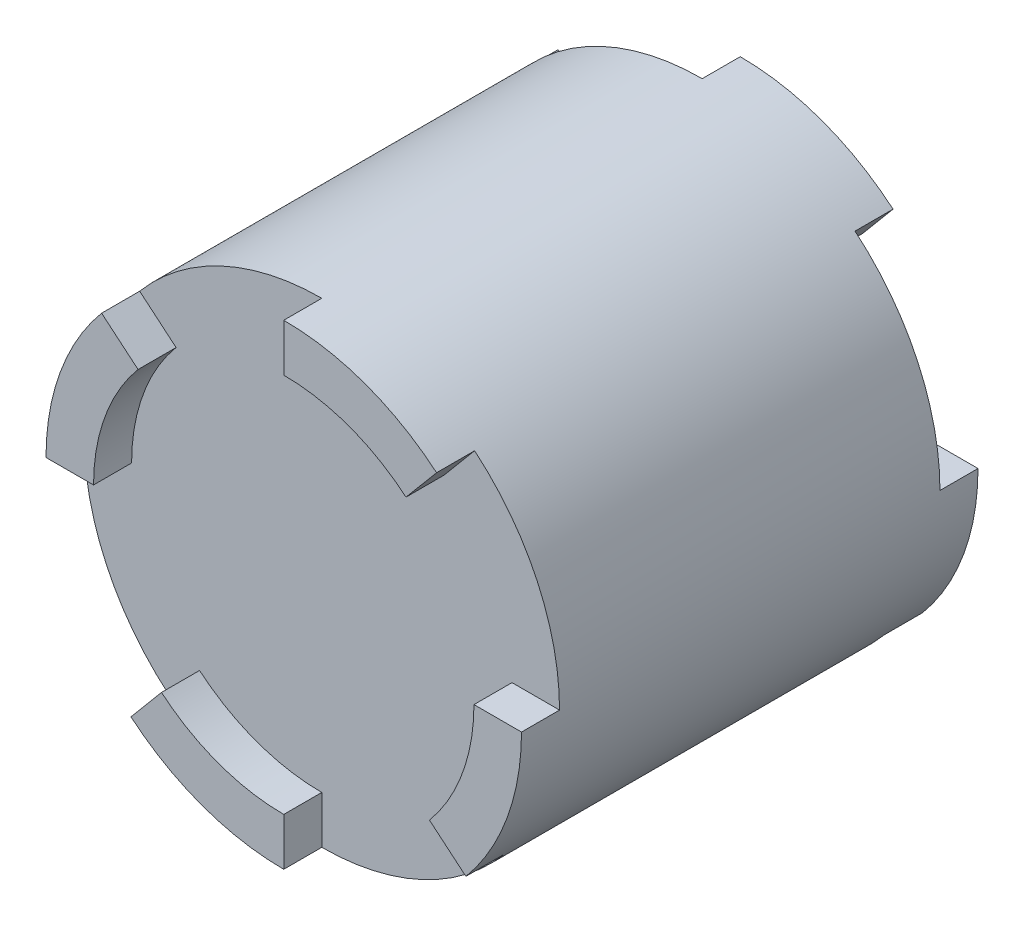
ISO-10303-21;
HEADER;
FILE_DESCRIPTION(('STEP AP214'),'2;1');
FILE_NAME('part.step','',(''),(''),'','','');
FILE_SCHEMA(('AUTOMOTIVE_DESIGN { 1 0 10303 214 1 1 1 1 }'));
ENDSEC;
DATA;
#1=APPLICATION_CONTEXT('core data for automotive mechanical design processes');
#2=APPLICATION_PROTOCOL_DEFINITION('international standard','automotive_design',2000,#1);
#3=PRODUCT_CONTEXT('',#1,'mechanical');
#4=PRODUCT('Part','Part','',(#3));
#5=PRODUCT_RELATED_PRODUCT_CATEGORY('part','',(#4));
#6=PRODUCT_DEFINITION_FORMATION('','',#4);
#7=PRODUCT_DEFINITION_CONTEXT('part definition',#1,'design');
#8=PRODUCT_DEFINITION('design','',#6,#7);
#9=PRODUCT_DEFINITION_SHAPE('','',#8);
#10=(LENGTH_UNIT() NAMED_UNIT(*) SI_UNIT(.MILLI.,.METRE.));
#11=(NAMED_UNIT(*) PLANE_ANGLE_UNIT() SI_UNIT($,.RADIAN.));
#12=(NAMED_UNIT(*) SI_UNIT($,.STERADIAN.) SOLID_ANGLE_UNIT());
#13=UNCERTAINTY_MEASURE_WITH_UNIT(LENGTH_MEASURE(1.E-05),#10,'distance_accuracy_value','');
#14=(GEOMETRIC_REPRESENTATION_CONTEXT(3) GLOBAL_UNCERTAINTY_ASSIGNED_CONTEXT((#13)) GLOBAL_UNIT_ASSIGNED_CONTEXT((#10,
#11,#12)) REPRESENTATION_CONTEXT('',''));
#15=CARTESIAN_POINT('',(0.,0.,0.));
#16=DIRECTION('',(0.,0.,1.));
#17=DIRECTION('',(1.,0.,0.));
#18=AXIS2_PLACEMENT_3D('',#15,#16,#17);
#19=CARTESIAN_POINT('',(0.,0.,20.));
#20=DIRECTION('',(0.,0.,1.));
#21=DIRECTION('',(1.,0.,0.));
#22=AXIS2_PLACEMENT_3D('',#19,#20,#21);
#23=PLANE('',#22);
#24=CARTESIAN_POINT('',(0.,0.,20.));
#25=DIRECTION('',(0.,0.,-1.));
#26=DIRECTION('',(1.,0.,0.));
#27=AXIS2_PLACEMENT_3D('',#24,#25,#26);
#28=CIRCLE('',#27,20.);
#29=CARTESIAN_POINT('',(0.,-20.,20.));
#30=VERTEX_POINT('',#29);
#31=CARTESIAN_POINT('',(-12.8557521937308,-15.3208888623795,20.));
#32=VERTEX_POINT('',#31);
#33=EDGE_CURVE('E391',#30,#32,#28,.T.);
#34=ORIENTED_EDGE('',*,*,#33,.F.);
#35=DIRECTION('',(0.,1.,0.));
#36=VECTOR('',#35,1.);
#37=CARTESIAN_POINT('',(0.,-20.,20.));
#38=LINE('',#37,#36);
#39=CARTESIAN_POINT('',(0.,-25.,20.));
#40=VERTEX_POINT('',#39);
#41=EDGE_CURVE('E377',#40,#30,#38,.T.);
#42=ORIENTED_EDGE('',*,*,#41,.F.);
#43=CARTESIAN_POINT('',(0.,0.,20.));
#44=DIRECTION('',(0.,0.,1.));
#45=DIRECTION('',(1.,0.,0.));
#46=AXIS2_PLACEMENT_3D('',#43,#44,#45);
#47=CIRCLE('',#46,25.);
#48=CARTESIAN_POINT('',(19.1511110779744,-16.0696902421635,20.));
#49=VERTEX_POINT('',#48);
#50=EDGE_CURVE('E49',#40,#49,#47,.T.);
#51=ORIENTED_EDGE('',*,*,#50,.T.);
#52=DIRECTION('',(0.766044443118977,-0.64278760968654,0.));
#53=VECTOR('',#52,1.);
#54=CARTESIAN_POINT('',(19.1511110779744,-16.0696902421635,20.));
#55=LINE('',#54,#53);
#56=CARTESIAN_POINT('',(15.3208888623795,-12.8557521937308,20.));
#57=VERTEX_POINT('',#56);
#58=EDGE_CURVE('E477',#57,#49,#55,.T.);
#59=ORIENTED_EDGE('',*,*,#58,.F.);
#60=CARTESIAN_POINT('',(0.,0.,20.));
#61=DIRECTION('',(0.,0.,-1.));
#62=DIRECTION('',(1.,0.,0.));
#63=AXIS2_PLACEMENT_3D('',#60,#61,#62);
#64=CIRCLE('',#63,20.);
#65=CARTESIAN_POINT('',(20.,0.,20.));
#66=VERTEX_POINT('',#65);
#67=EDGE_CURVE('E463',#66,#57,#64,.T.);
#68=ORIENTED_EDGE('',*,*,#67,.F.);
#69=DIRECTION('',(-1.,0.,0.));
#70=VECTOR('',#69,1.);
#71=CARTESIAN_POINT('',(25.,0.,20.));
#72=LINE('',#71,#70);
#73=CARTESIAN_POINT('',(25.,0.,20.));
#74=VERTEX_POINT('',#73);
#75=EDGE_CURVE('E468',#74,#66,#72,.T.);
#76=ORIENTED_EDGE('',*,*,#75,.F.);
#77=CARTESIAN_POINT('',(16.0696902421635,19.1511110779744,20.));
#78=VERTEX_POINT('',#77);
#79=EDGE_CURVE('E11',#74,#78,#47,.T.);
#80=ORIENTED_EDGE('',*,*,#79,.T.);
#81=DIRECTION('',(0.64278760968654,0.766044443118977,0.));
#82=VECTOR('',#81,1.);
#83=CARTESIAN_POINT('',(16.0696902421635,19.1511110779744,20.));
#84=LINE('',#83,#82);
#85=CARTESIAN_POINT('',(12.8557521937308,15.3208888623795,20.));
#86=VERTEX_POINT('',#85);
#87=EDGE_CURVE('E442',#86,#78,#84,.T.);
#88=ORIENTED_EDGE('',*,*,#87,.F.);
#89=CARTESIAN_POINT('',(0.,0.,20.));
#90=DIRECTION('',(0.,0.,-1.));
#91=DIRECTION('',(1.,0.,0.));
#92=AXIS2_PLACEMENT_3D('',#89,#90,#91);
#93=CIRCLE('',#92,20.);
#94=CARTESIAN_POINT('',(0.,20.,20.));
#95=VERTEX_POINT('',#94);
#96=EDGE_CURVE('E450',#95,#86,#93,.T.);
#97=ORIENTED_EDGE('',*,*,#96,.F.);
#98=DIRECTION('',(0.,-1.,0.));
#99=VECTOR('',#98,1.);
#100=CARTESIAN_POINT('',(0.,25.,20.));
#101=LINE('',#100,#99);
#102=CARTESIAN_POINT('',(0.,25.,20.));
#103=VERTEX_POINT('',#102);
#104=EDGE_CURVE('E437',#103,#95,#101,.T.);
#105=ORIENTED_EDGE('',*,*,#104,.F.);
#106=CARTESIAN_POINT('',(-19.1511110779744,16.0696902421635,20.));
#107=VERTEX_POINT('',#106);
#108=EDGE_CURVE('E48',#103,#107,#47,.T.);
#109=ORIENTED_EDGE('',*,*,#108,.T.);
#110=DIRECTION('',(-0.766044443118978,0.64278760968654,0.));
#111=VECTOR('',#110,1.);
#112=CARTESIAN_POINT('',(-19.1511110779744,16.0696902421635,20.));
#113=LINE('',#112,#111);
#114=CARTESIAN_POINT('',(-15.3208888623795,12.8557521937308,20.));
#115=VERTEX_POINT('',#114);
#116=EDGE_CURVE('E412',#115,#107,#113,.T.);
#117=ORIENTED_EDGE('',*,*,#116,.F.);
#118=CARTESIAN_POINT('',(0.,0.,20.));
#119=DIRECTION('',(0.,0.,-1.));
#120=DIRECTION('',(1.,0.,0.));
#121=AXIS2_PLACEMENT_3D('',#118,#119,#120);
#122=CIRCLE('',#121,20.);
#123=CARTESIAN_POINT('',(-20.,0.,20.));
#124=VERTEX_POINT('',#123);
#125=EDGE_CURVE('E421',#124,#115,#122,.T.);
#126=ORIENTED_EDGE('',*,*,#125,.F.);
#127=DIRECTION('',(1.,0.,0.));
#128=VECTOR('',#127,1.);
#129=CARTESIAN_POINT('',(-25.,0.,20.));
#130=LINE('',#129,#128);
#131=CARTESIAN_POINT('',(-25.,0.,20.));
#132=VERTEX_POINT('',#131);
#133=EDGE_CURVE('E407',#132,#124,#130,.T.);
#134=ORIENTED_EDGE('',*,*,#133,.F.);
#135=CARTESIAN_POINT('',(-16.0696902421635,-19.1511110779744,20.));
#136=VERTEX_POINT('',#135);
#137=EDGE_CURVE('E498',#132,#136,#47,.T.);
#138=ORIENTED_EDGE('',*,*,#137,.T.);
#139=DIRECTION('',(-0.64278760968654,-0.766044443118977,0.));
#140=VECTOR('',#139,1.);
#141=CARTESIAN_POINT('',(-12.8557521937308,-15.3208888623795,20.));
#142=LINE('',#141,#140);
#143=EDGE_CURVE('E382',#32,#136,#142,.T.);
#144=ORIENTED_EDGE('',*,*,#143,.F.);
#145=EDGE_LOOP('',(#34,#42,#51,#59,#68,#76,#80,#88,#97,#105,#109,#117,#126,#134,#138,#144));
#146=FACE_BOUND('',#145,.T.);
#147=ADVANCED_FACE('F39',(#146),#23,.T.);
#148=CARTESIAN_POINT('',(0.,0.,20.));
#149=DIRECTION('',(0.,0.,-1.));
#150=DIRECTION('',(-1.,0.,0.));
#151=AXIS2_PLACEMENT_3D('',#148,#149,#150);
#152=CYLINDRICAL_SURFACE('',#151,25.);
#153=ORIENTED_EDGE('',*,*,#79,.F.);
#154=DIRECTION('',(0.,0.,-1.));
#155=VECTOR('',#154,1.);
#156=CARTESIAN_POINT('',(25.,0.,24.));
#157=LINE('',#156,#155);
#158=CARTESIAN_POINT('',(25.,0.,24.));
#159=VERTEX_POINT('',#158);
#160=EDGE_CURVE('E484',#159,#74,#157,.T.);
#161=ORIENTED_EDGE('',*,*,#160,.F.);
#162=CARTESIAN_POINT('',(0.,0.,24.));
#163=DIRECTION('',(0.,0.,1.));
#164=DIRECTION('',(1.,0.,0.));
#165=AXIS2_PLACEMENT_3D('',#162,#163,#164);
#166=CIRCLE('',#165,25.);
#167=CARTESIAN_POINT('',(19.1511110779744,-16.0696902421635,24.));
#168=VERTEX_POINT('',#167);
#169=EDGE_CURVE('E470',#168,#159,#166,.T.);
#170=ORIENTED_EDGE('',*,*,#169,.F.);
#171=DIRECTION('',(0.,0.,-1.));
#172=VECTOR('',#171,1.);
#173=CARTESIAN_POINT('',(19.1511110779744,-16.0696902421635,24.));
#174=LINE('',#173,#172);
#175=EDGE_CURVE('E487',#168,#49,#174,.T.);
#176=ORIENTED_EDGE('',*,*,#175,.T.);
#177=ORIENTED_EDGE('',*,*,#50,.F.);
#178=DIRECTION('',(0.,0.,-1.));
#179=VECTOR('',#178,1.);
#180=CARTESIAN_POINT('',(0.,-25.,24.));
#181=LINE('',#180,#179);
#182=CARTESIAN_POINT('',(0.,-25.,24.));
#183=VERTEX_POINT('',#182);
#184=EDGE_CURVE('E404',#183,#40,#181,.T.);
#185=ORIENTED_EDGE('',*,*,#184,.F.);
#186=CARTESIAN_POINT('',(0.,0.,24.));
#187=DIRECTION('',(0.,0.,1.));
#188=DIRECTION('',(1.,0.,0.));
#189=AXIS2_PLACEMENT_3D('',#186,#187,#188);
#190=CIRCLE('',#189,25.);
#191=CARTESIAN_POINT('',(-16.0696902421635,-19.1511110779744,24.));
#192=VERTEX_POINT('',#191);
#193=EDGE_CURVE('E378',#192,#183,#190,.T.);
#194=ORIENTED_EDGE('',*,*,#193,.F.);
#195=DIRECTION('',(0.,0.,-1.));
#196=VECTOR('',#195,1.);
#197=CARTESIAN_POINT('',(-16.0696902421635,-19.1511110779744,24.));
#198=LINE('',#197,#196);
#199=EDGE_CURVE('E388',#192,#136,#198,.T.);
#200=ORIENTED_EDGE('',*,*,#199,.T.);
#201=ORIENTED_EDGE('',*,*,#137,.F.);
#202=DIRECTION('',(0.,0.,-1.));
#203=VECTOR('',#202,1.);
#204=CARTESIAN_POINT('',(-25.,0.,24.));
#205=LINE('',#204,#203);
#206=CARTESIAN_POINT('',(-25.,0.,24.));
#207=VERTEX_POINT('',#206);
#208=EDGE_CURVE('E434',#207,#132,#205,.T.);
#209=ORIENTED_EDGE('',*,*,#208,.F.);
#210=CARTESIAN_POINT('',(0.,0.,24.));
#211=DIRECTION('',(0.,0.,1.));
#212=DIRECTION('',(1.,0.,0.));
#213=AXIS2_PLACEMENT_3D('',#210,#211,#212);
#214=CIRCLE('',#213,25.);
#215=CARTESIAN_POINT('',(-19.1511110779744,16.0696902421635,24.));
#216=VERTEX_POINT('',#215);
#217=EDGE_CURVE('E408',#216,#207,#214,.T.);
#218=ORIENTED_EDGE('',*,*,#217,.F.);
#219=DIRECTION('',(0.,0.,-1.));
#220=VECTOR('',#219,1.);
#221=CARTESIAN_POINT('',(-19.1511110779744,16.0696902421635,24.));
#222=LINE('',#221,#220);
#223=EDGE_CURVE('E418',#216,#107,#222,.T.);
#224=ORIENTED_EDGE('',*,*,#223,.T.);
#225=ORIENTED_EDGE('',*,*,#108,.F.);
#226=DIRECTION('',(0.,0.,-1.));
#227=VECTOR('',#226,1.);
#228=CARTESIAN_POINT('',(0.,25.,24.));
#229=LINE('',#228,#227);
#230=CARTESIAN_POINT('',(0.,25.,24.));
#231=VERTEX_POINT('',#230);
#232=EDGE_CURVE('E461',#231,#103,#229,.T.);
#233=ORIENTED_EDGE('',*,*,#232,.F.);
#234=CARTESIAN_POINT('',(0.,0.,24.));
#235=DIRECTION('',(0.,0.,1.));
#236=DIRECTION('',(1.,0.,0.));
#237=AXIS2_PLACEMENT_3D('',#234,#235,#236);
#238=CIRCLE('',#237,25.);
#239=CARTESIAN_POINT('',(16.0696902421635,19.1511110779744,24.));
#240=VERTEX_POINT('',#239);
#241=EDGE_CURVE('E438',#240,#231,#238,.T.);
#242=ORIENTED_EDGE('',*,*,#241,.F.);
#243=DIRECTION('',(0.,0.,-1.));
#244=VECTOR('',#243,1.);
#245=CARTESIAN_POINT('',(16.0696902421635,19.1511110779744,24.));
#246=LINE('',#245,#244);
#247=EDGE_CURVE('E448',#240,#78,#246,.T.);
#248=ORIENTED_EDGE('',*,*,#247,.T.);
#249=EDGE_LOOP('',(#153,#161,#170,#176,#177,#185,#194,#200,#201,#209,#218,#224,#225,#233,#242,#248));
#250=FACE_BOUND('',#249,.T.);
#251=CARTESIAN_POINT('',(0.,0.,-20.));
#252=DIRECTION('',(0.,0.,1.));
#253=DIRECTION('',(1.,0.,0.));
#254=AXIS2_PLACEMENT_3D('',#251,#252,#253);
#255=CIRCLE('',#254,25.);
#256=CARTESIAN_POINT('',(25.,0.,-20.));
#257=VERTEX_POINT('',#256);
#258=CARTESIAN_POINT('',(16.0696902421635,19.1511110779744,-20.));
#259=VERTEX_POINT('',#258);
#260=EDGE_CURVE('E43',#257,#259,#255,.T.);
#261=ORIENTED_EDGE('',*,*,#260,.T.);
#262=DIRECTION('',(0.,0.,1.));
#263=VECTOR('',#262,1.);
#264=CARTESIAN_POINT('',(16.0696902421635,19.1511110779744,-24.));
#265=LINE('',#264,#263);
#266=CARTESIAN_POINT('',(16.0696902421635,19.1511110779744,-24.));
#267=VERTEX_POINT('',#266);
#268=EDGE_CURVE('E344',#267,#259,#265,.T.);
#269=ORIENTED_EDGE('',*,*,#268,.F.);
#270=CARTESIAN_POINT('',(0.,0.,-24.));
#271=DIRECTION('',(0.,0.,1.));
#272=DIRECTION('',(1.,0.,0.));
#273=AXIS2_PLACEMENT_3D('',#270,#271,#272);
#274=CIRCLE('',#273,25.);
#275=CARTESIAN_POINT('',(0.,25.,-24.));
#276=VERTEX_POINT('',#275);
#277=EDGE_CURVE('E317',#267,#276,#274,.T.);
#278=ORIENTED_EDGE('',*,*,#277,.T.);
#279=DIRECTION('',(0.,0.,1.));
#280=VECTOR('',#279,1.);
#281=CARTESIAN_POINT('',(0.,25.,-24.));
#282=LINE('',#281,#280);
#283=CARTESIAN_POINT('',(0.,25.,-20.));
#284=VERTEX_POINT('',#283);
#285=EDGE_CURVE('E330',#276,#284,#282,.T.);
#286=ORIENTED_EDGE('',*,*,#285,.T.);
#287=CARTESIAN_POINT('',(-19.1511110779744,16.0696902421635,-20.));
#288=VERTEX_POINT('',#287);
#289=EDGE_CURVE('E496',#284,#288,#255,.T.);
#290=ORIENTED_EDGE('',*,*,#289,.T.);
#291=DIRECTION('',(0.,0.,1.));
#292=VECTOR('',#291,1.);
#293=CARTESIAN_POINT('',(-19.1511110779744,16.0696902421635,-24.));
#294=LINE('',#293,#292);
#295=CARTESIAN_POINT('',(-19.1511110779744,16.0696902421635,-24.));
#296=VERTEX_POINT('',#295);
#297=EDGE_CURVE('E314',#296,#288,#294,.T.);
#298=ORIENTED_EDGE('',*,*,#297,.F.);
#299=CARTESIAN_POINT('',(0.,0.,-24.));
#300=DIRECTION('',(0.,0.,1.));
#301=DIRECTION('',(1.,0.,0.));
#302=AXIS2_PLACEMENT_3D('',#299,#300,#301);
#303=CIRCLE('',#302,25.);
#304=CARTESIAN_POINT('',(-25.,0.,-24.));
#305=VERTEX_POINT('',#304);
#306=EDGE_CURVE('E290',#296,#305,#303,.T.);
#307=ORIENTED_EDGE('',*,*,#306,.T.);
#308=DIRECTION('',(0.,0.,1.));
#309=VECTOR('',#308,1.);
#310=CARTESIAN_POINT('',(-25.,0.,-24.));
#311=LINE('',#310,#309);
#312=CARTESIAN_POINT('',(-25.,0.,-20.));
#313=VERTEX_POINT('',#312);
#314=EDGE_CURVE('E303',#305,#313,#311,.T.);
#315=ORIENTED_EDGE('',*,*,#314,.T.);
#316=CARTESIAN_POINT('',(-16.0696902421635,-19.1511110779744,-20.));
#317=VERTEX_POINT('',#316);
#318=EDGE_CURVE('E256',#313,#317,#255,.T.);
#319=ORIENTED_EDGE('',*,*,#318,.T.);
#320=DIRECTION('',(0.,0.,1.));
#321=VECTOR('',#320,1.);
#322=CARTESIAN_POINT('',(-16.0696902421635,-19.1511110779744,-24.));
#323=LINE('',#322,#321);
#324=CARTESIAN_POINT('',(-16.0696902421635,-19.1511110779744,-24.));
#325=VERTEX_POINT('',#324);
#326=EDGE_CURVE('E250',#325,#317,#323,.T.);
#327=ORIENTED_EDGE('',*,*,#326,.F.);
#328=CARTESIAN_POINT('',(0.,0.,-24.));
#329=DIRECTION('',(0.,0.,1.));
#330=DIRECTION('',(1.,0.,0.));
#331=AXIS2_PLACEMENT_3D('',#328,#329,#330);
#332=CIRCLE('',#331,25.);
#333=CARTESIAN_POINT('',(0.,-25.,-24.));
#334=VERTEX_POINT('',#333);
#335=EDGE_CURVE('E253',#325,#334,#332,.T.);
#336=ORIENTED_EDGE('',*,*,#335,.T.);
#337=DIRECTION('',(0.,0.,1.));
#338=VECTOR('',#337,1.);
#339=CARTESIAN_POINT('',(0.,-25.,-24.));
#340=LINE('',#339,#338);
#341=CARTESIAN_POINT('',(0.,-25.,-20.));
#342=VERTEX_POINT('',#341);
#343=EDGE_CURVE('E280',#334,#342,#340,.T.);
#344=ORIENTED_EDGE('',*,*,#343,.T.);
#345=CARTESIAN_POINT('',(19.1511110779744,-16.0696902421635,-20.));
#346=VERTEX_POINT('',#345);
#347=EDGE_CURVE('E492',#342,#346,#255,.T.);
#348=ORIENTED_EDGE('',*,*,#347,.T.);
#349=DIRECTION('',(0.,0.,1.));
#350=VECTOR('',#349,1.);
#351=CARTESIAN_POINT('',(19.1511110779744,-16.0696902421635,-24.));
#352=LINE('',#351,#350);
#353=CARTESIAN_POINT('',(19.1511110779744,-16.0696902421635,-24.));
#354=VERTEX_POINT('',#353);
#355=EDGE_CURVE('E369',#354,#346,#352,.T.);
#356=ORIENTED_EDGE('',*,*,#355,.F.);
#357=CARTESIAN_POINT('',(0.,0.,-24.));
#358=DIRECTION('',(0.,0.,1.));
#359=DIRECTION('',(1.,0.,0.));
#360=AXIS2_PLACEMENT_3D('',#357,#358,#359);
#361=CIRCLE('',#360,25.);
#362=CARTESIAN_POINT('',(25.,0.,-24.));
#363=VERTEX_POINT('',#362);
#364=EDGE_CURVE('E354',#354,#363,#361,.T.);
#365=ORIENTED_EDGE('',*,*,#364,.T.);
#366=DIRECTION('',(0.,0.,1.));
#367=VECTOR('',#366,1.);
#368=CARTESIAN_POINT('',(25.,0.,-24.));
#369=LINE('',#368,#367);
#370=EDGE_CURVE('E372',#363,#257,#369,.T.);
#371=ORIENTED_EDGE('',*,*,#370,.T.);
#372=EDGE_LOOP('',(#261,#269,#278,#286,#290,#298,#307,#315,#319,#327,#336,#344,#348,#356,#365,#371));
#373=FACE_BOUND('',#372,.T.);
#374=ADVANCED_FACE('F41',(#250,#373),#152,.T.);
#375=CARTESIAN_POINT('',(0.,0.,-20.));
#376=DIRECTION('',(0.,0.,1.));
#377=DIRECTION('',(1.,0.,0.));
#378=AXIS2_PLACEMENT_3D('',#375,#376,#377);
#379=PLANE('',#378);
#380=CARTESIAN_POINT('',(0.,0.,-20.));
#381=DIRECTION('',(0.,0.,-1.));
#382=DIRECTION('',(1.,0.,0.));
#383=AXIS2_PLACEMENT_3D('',#380,#381,#382);
#384=CIRCLE('',#383,20.);
#385=CARTESIAN_POINT('',(0.,-20.,-20.));
#386=VERTEX_POINT('',#385);
#387=CARTESIAN_POINT('',(-12.8557521937308,-15.3208888623795,-20.));
#388=VERTEX_POINT('',#387);
#389=EDGE_CURVE('E56',#386,#388,#384,.T.);
#390=ORIENTED_EDGE('',*,*,#389,.T.);
#391=DIRECTION('',(-0.64278760968654,-0.766044443118977,0.));
#392=VECTOR('',#391,1.);
#393=CARTESIAN_POINT('',(-12.8557521937308,-15.3208888623795,-20.));
#394=LINE('',#393,#392);
#395=EDGE_CURVE('E281',#388,#317,#394,.T.);
#396=ORIENTED_EDGE('',*,*,#395,.T.);
#397=ORIENTED_EDGE('',*,*,#318,.F.);
#398=DIRECTION('',(1.,0.,0.));
#399=VECTOR('',#398,1.);
#400=CARTESIAN_POINT('',(-25.,0.,-20.));
#401=LINE('',#400,#399);
#402=CARTESIAN_POINT('',(-20.,0.,-20.));
#403=VERTEX_POINT('',#402);
#404=EDGE_CURVE('E294',#313,#403,#401,.T.);
#405=ORIENTED_EDGE('',*,*,#404,.T.);
#406=CARTESIAN_POINT('',(0.,0.,-20.));
#407=DIRECTION('',(0.,0.,-1.));
#408=DIRECTION('',(1.,0.,0.));
#409=AXIS2_PLACEMENT_3D('',#406,#407,#408);
#410=CIRCLE('',#409,20.);
#411=CARTESIAN_POINT('',(-15.3208888623795,12.8557521937308,-20.));
#412=VERTEX_POINT('',#411);
#413=EDGE_CURVE('E64',#403,#412,#410,.T.);
#414=ORIENTED_EDGE('',*,*,#413,.T.);
#415=DIRECTION('',(-0.766044443118978,0.64278760968654,0.));
#416=VECTOR('',#415,1.);
#417=CARTESIAN_POINT('',(-19.1511110779744,16.0696902421635,-20.));
#418=LINE('',#417,#416);
#419=EDGE_CURVE('E261',#412,#288,#418,.T.);
#420=ORIENTED_EDGE('',*,*,#419,.T.);
#421=ORIENTED_EDGE('',*,*,#289,.F.);
#422=DIRECTION('',(0.,-1.,0.));
#423=VECTOR('',#422,1.);
#424=CARTESIAN_POINT('',(0.,25.,-20.));
#425=LINE('',#424,#423);
#426=CARTESIAN_POINT('',(0.,20.,-20.));
#427=VERTEX_POINT('',#426);
#428=EDGE_CURVE('E321',#284,#427,#425,.T.);
#429=ORIENTED_EDGE('',*,*,#428,.T.);
#430=CARTESIAN_POINT('',(0.,0.,-20.));
#431=DIRECTION('',(0.,0.,-1.));
#432=DIRECTION('',(1.,0.,0.));
#433=AXIS2_PLACEMENT_3D('',#430,#431,#432);
#434=CIRCLE('',#433,20.);
#435=CARTESIAN_POINT('',(12.8557521937308,15.3208888623795,-20.));
#436=VERTEX_POINT('',#435);
#437=EDGE_CURVE('E333',#427,#436,#434,.T.);
#438=ORIENTED_EDGE('',*,*,#437,.T.);
#439=DIRECTION('',(0.64278760968654,0.766044443118977,0.));
#440=VECTOR('',#439,1.);
#441=CARTESIAN_POINT('',(16.0696902421635,19.1511110779744,-20.));
#442=LINE('',#441,#440);
#443=EDGE_CURVE('E316',#436,#259,#442,.T.);
#444=ORIENTED_EDGE('',*,*,#443,.T.);
#445=ORIENTED_EDGE('',*,*,#260,.F.);
#446=DIRECTION('',(-1.,0.,0.));
#447=VECTOR('',#446,1.);
#448=CARTESIAN_POINT('',(25.,0.,-20.));
#449=LINE('',#448,#447);
#450=CARTESIAN_POINT('',(20.,0.,-20.));
#451=VERTEX_POINT('',#450);
#452=EDGE_CURVE('E363',#257,#451,#449,.T.);
#453=ORIENTED_EDGE('',*,*,#452,.T.);
#454=CARTESIAN_POINT('',(0.,0.,-20.));
#455=DIRECTION('',(0.,0.,-1.));
#456=DIRECTION('',(1.,0.,0.));
#457=AXIS2_PLACEMENT_3D('',#454,#455,#456);
#458=CIRCLE('',#457,20.);
#459=CARTESIAN_POINT('',(15.3208888623795,-12.8557521937308,-20.));
#460=VERTEX_POINT('',#459);
#461=EDGE_CURVE('E346',#451,#460,#458,.T.);
#462=ORIENTED_EDGE('',*,*,#461,.T.);
#463=DIRECTION('',(0.766044443118977,-0.64278760968654,0.));
#464=VECTOR('',#463,1.);
#465=CARTESIAN_POINT('',(19.1511110779744,-16.0696902421635,-20.));
#466=LINE('',#465,#464);
#467=EDGE_CURVE('E351',#460,#346,#466,.T.);
#468=ORIENTED_EDGE('',*,*,#467,.T.);
#469=ORIENTED_EDGE('',*,*,#347,.F.);
#470=DIRECTION('',(0.,1.,0.));
#471=VECTOR('',#470,1.);
#472=CARTESIAN_POINT('',(0.,-20.,-20.));
#473=LINE('',#472,#471);
#474=EDGE_CURVE('E272',#342,#386,#473,.T.);
#475=ORIENTED_EDGE('',*,*,#474,.T.);
#476=EDGE_LOOP('',(#390,#396,#397,#405,#414,#420,#421,#429,#438,#444,#445,#453,#462,#468,#469,#475));
#477=FACE_BOUND('',#476,.T.);
#478=ADVANCED_FACE('F504',(#477),#379,.F.);
#479=CARTESIAN_POINT('',(0.,0.,24.));
#480=DIRECTION('',(0.,0.,-1.));
#481=DIRECTION('',(-1.,0.,0.));
#482=AXIS2_PLACEMENT_3D('',#479,#480,#481);
#483=CYLINDRICAL_SURFACE('',#482,20.);
#484=ORIENTED_EDGE('',*,*,#67,.T.);
#485=DIRECTION('',(0.,0.,-1.));
#486=VECTOR('',#485,1.);
#487=CARTESIAN_POINT('',(15.3208888623795,-12.8557521937308,24.));
#488=LINE('',#487,#486);
#489=CARTESIAN_POINT('',(15.3208888623795,-12.8557521937308,24.));
#490=VERTEX_POINT('',#489);
#491=EDGE_CURVE('E490',#490,#57,#488,.T.);
#492=ORIENTED_EDGE('',*,*,#491,.F.);
#493=CARTESIAN_POINT('',(0.,0.,24.));
#494=DIRECTION('',(0.,0.,-1.));
#495=DIRECTION('',(1.,0.,0.));
#496=AXIS2_PLACEMENT_3D('',#493,#494,#495);
#497=CIRCLE('',#496,20.);
#498=CARTESIAN_POINT('',(20.,0.,24.));
#499=VERTEX_POINT('',#498);
#500=EDGE_CURVE('E464',#499,#490,#497,.T.);
#501=ORIENTED_EDGE('',*,*,#500,.F.);
#502=DIRECTION('',(0.,0.,-1.));
#503=VECTOR('',#502,1.);
#504=CARTESIAN_POINT('',(20.,0.,24.));
#505=LINE('',#504,#503);
#506=EDGE_CURVE('E474',#499,#66,#505,.T.);
#507=ORIENTED_EDGE('',*,*,#506,.T.);
#508=EDGE_LOOP('',(#484,#492,#501,#507));
#509=FACE_BOUND('',#508,.T.);
#510=ADVANCED_FACE('F537',(#509),#483,.F.);
#511=CARTESIAN_POINT('',(19.1511110779744,-16.0696902421635,24.));
#512=DIRECTION('',(0.642787609686541,0.766044443118977,0.));
#513=DIRECTION('',(-0.766044443118977,0.642787609686541,0.));
#514=AXIS2_PLACEMENT_3D('',#511,#512,#513);
#515=PLANE('',#514);
#516=ORIENTED_EDGE('',*,*,#58,.T.);
#517=ORIENTED_EDGE('',*,*,#175,.F.);
#518=DIRECTION('',(0.766044443118977,-0.64278760968654,0.));
#519=VECTOR('',#518,1.);
#520=CARTESIAN_POINT('',(19.1511110779744,-16.0696902421635,24.));
#521=LINE('',#520,#519);
#522=EDGE_CURVE('E467',#490,#168,#521,.T.);
#523=ORIENTED_EDGE('',*,*,#522,.F.);
#524=ORIENTED_EDGE('',*,*,#491,.T.);
#525=EDGE_LOOP('',(#516,#517,#523,#524));
#526=FACE_BOUND('',#525,.T.);
#527=ADVANCED_FACE('F543',(#526),#515,.F.);
#528=CARTESIAN_POINT('',(25.,0.,24.));
#529=DIRECTION('',(0.,-1.,0.));
#530=DIRECTION('',(1.,0.,0.));
#531=AXIS2_PLACEMENT_3D('',#528,#529,#530);
#532=PLANE('',#531);
#533=ORIENTED_EDGE('',*,*,#75,.T.);
#534=ORIENTED_EDGE('',*,*,#506,.F.);
#535=DIRECTION('',(-1.,0.,0.));
#536=VECTOR('',#535,1.);
#537=CARTESIAN_POINT('',(25.,0.,24.));
#538=LINE('',#537,#536);
#539=EDGE_CURVE('E472',#159,#499,#538,.T.);
#540=ORIENTED_EDGE('',*,*,#539,.F.);
#541=ORIENTED_EDGE('',*,*,#160,.T.);
#542=EDGE_LOOP('',(#533,#534,#540,#541));
#543=FACE_BOUND('',#542,.T.);
#544=ADVANCED_FACE('F548',(#543),#532,.F.);
#545=CARTESIAN_POINT('',(0.,0.,24.));
#546=DIRECTION('',(0.,0.,1.));
#547=DIRECTION('',(1.,0.,0.));
#548=AXIS2_PLACEMENT_3D('',#545,#546,#547);
#549=PLANE('',#548);
#550=ORIENTED_EDGE('',*,*,#500,.T.);
#551=ORIENTED_EDGE('',*,*,#522,.T.);
#552=ORIENTED_EDGE('',*,*,#169,.T.);
#553=ORIENTED_EDGE('',*,*,#539,.T.);
#554=EDGE_LOOP('',(#550,#551,#552,#553));
#555=FACE_BOUND('',#554,.T.);
#556=ADVANCED_FACE('F627',(#555),#549,.T.);
#557=CARTESIAN_POINT('',(0.,25.,24.));
#558=DIRECTION('',(1.,0.,0.));
#559=DIRECTION('',(0.,1.,0.));
#560=AXIS2_PLACEMENT_3D('',#557,#558,#559);
#561=PLANE('',#560);
#562=ORIENTED_EDGE('',*,*,#104,.T.);
#563=DIRECTION('',(0.,0.,-1.));
#564=VECTOR('',#563,1.);
#565=CARTESIAN_POINT('',(0.,20.,24.));
#566=LINE('',#565,#564);
#567=CARTESIAN_POINT('',(0.,20.,24.));
#568=VERTEX_POINT('',#567);
#569=EDGE_CURVE('E458',#568,#95,#566,.T.);
#570=ORIENTED_EDGE('',*,*,#569,.F.);
#571=DIRECTION('',(0.,-1.,0.));
#572=VECTOR('',#571,1.);
#573=CARTESIAN_POINT('',(0.,25.,24.));
#574=LINE('',#573,#572);
#575=EDGE_CURVE('E441',#231,#568,#574,.T.);
#576=ORIENTED_EDGE('',*,*,#575,.F.);
#577=ORIENTED_EDGE('',*,*,#232,.T.);
#578=EDGE_LOOP('',(#562,#570,#576,#577));
#579=FACE_BOUND('',#578,.T.);
#580=ADVANCED_FACE('F570',(#579),#561,.F.);
#581=CARTESIAN_POINT('',(0.,0.,24.));
#582=DIRECTION('',(0.,0.,-1.));
#583=DIRECTION('',(-1.,0.,0.));
#584=AXIS2_PLACEMENT_3D('',#581,#582,#583);
#585=CYLINDRICAL_SURFACE('',#584,20.);
#586=ORIENTED_EDGE('',*,*,#96,.T.);
#587=DIRECTION('',(0.,0.,-1.));
#588=VECTOR('',#587,1.);
#589=CARTESIAN_POINT('',(12.8557521937308,15.3208888623795,24.));
#590=LINE('',#589,#588);
#591=CARTESIAN_POINT('',(12.8557521937308,15.3208888623795,24.));
#592=VERTEX_POINT('',#591);
#593=EDGE_CURVE('E456',#592,#86,#590,.T.);
#594=ORIENTED_EDGE('',*,*,#593,.F.);
#595=CARTESIAN_POINT('',(0.,0.,24.));
#596=DIRECTION('',(0.,0.,-1.));
#597=DIRECTION('',(1.,0.,0.));
#598=AXIS2_PLACEMENT_3D('',#595,#596,#597);
#599=CIRCLE('',#598,20.);
#600=EDGE_CURVE('E444',#568,#592,#599,.T.);
#601=ORIENTED_EDGE('',*,*,#600,.F.);
#602=ORIENTED_EDGE('',*,*,#569,.T.);
#603=EDGE_LOOP('',(#586,#594,#601,#602));
#604=FACE_BOUND('',#603,.T.);
#605=ADVANCED_FACE('F567',(#604),#585,.F.);
#606=CARTESIAN_POINT('',(16.0696902421635,19.1511110779744,24.));
#607=DIRECTION('',(-0.766044443118977,0.642787609686541,0.));
#608=DIRECTION('',(-0.642787609686541,-0.766044443118977,0.));
#609=AXIS2_PLACEMENT_3D('',#606,#607,#608);
#610=PLANE('',#609);
#611=ORIENTED_EDGE('',*,*,#87,.T.);
#612=ORIENTED_EDGE('',*,*,#247,.F.);
#613=DIRECTION('',(0.64278760968654,0.766044443118977,0.));
#614=VECTOR('',#613,1.);
#615=CARTESIAN_POINT('',(16.0696902421635,19.1511110779744,24.));
#616=LINE('',#615,#614);
#617=EDGE_CURVE('E446',#592,#240,#616,.T.);
#618=ORIENTED_EDGE('',*,*,#617,.F.);
#619=ORIENTED_EDGE('',*,*,#593,.T.);
#620=EDGE_LOOP('',(#611,#612,#618,#619));
#621=FACE_BOUND('',#620,.T.);
#622=ADVANCED_FACE('F562',(#621),#610,.F.);
#623=CARTESIAN_POINT('',(0.,0.,24.));
#624=DIRECTION('',(0.,0.,1.));
#625=DIRECTION('',(1.,0.,0.));
#626=AXIS2_PLACEMENT_3D('',#623,#624,#625);
#627=PLANE('',#626);
#628=ORIENTED_EDGE('',*,*,#241,.T.);
#629=ORIENTED_EDGE('',*,*,#575,.T.);
#630=ORIENTED_EDGE('',*,*,#600,.T.);
#631=ORIENTED_EDGE('',*,*,#617,.T.);
#632=EDGE_LOOP('',(#628,#629,#630,#631));
#633=FACE_BOUND('',#632,.T.);
#634=ADVANCED_FACE('F616',(#633),#627,.T.);
#635=CARTESIAN_POINT('',(-25.,0.,24.));
#636=DIRECTION('',(0.,1.,0.));
#637=DIRECTION('',(-1.,0.,0.));
#638=AXIS2_PLACEMENT_3D('',#635,#636,#637);
#639=PLANE('',#638);
#640=ORIENTED_EDGE('',*,*,#133,.T.);
#641=DIRECTION('',(0.,0.,-1.));
#642=VECTOR('',#641,1.);
#643=CARTESIAN_POINT('',(-20.,0.,24.));
#644=LINE('',#643,#642);
#645=CARTESIAN_POINT('',(-20.,0.,24.));
#646=VERTEX_POINT('',#645);
#647=EDGE_CURVE('E431',#646,#124,#644,.T.);
#648=ORIENTED_EDGE('',*,*,#647,.F.);
#649=DIRECTION('',(1.,0.,0.));
#650=VECTOR('',#649,1.);
#651=CARTESIAN_POINT('',(-25.,0.,24.));
#652=LINE('',#651,#650);
#653=EDGE_CURVE('E411',#207,#646,#652,.T.);
#654=ORIENTED_EDGE('',*,*,#653,.F.);
#655=ORIENTED_EDGE('',*,*,#208,.T.);
#656=EDGE_LOOP('',(#640,#648,#654,#655));
#657=FACE_BOUND('',#656,.T.);
#658=ADVANCED_FACE('F612',(#657),#639,.F.);
#659=CARTESIAN_POINT('',(0.,0.,24.));
#660=DIRECTION('',(0.,0.,-1.));
#661=DIRECTION('',(-1.,0.,0.));
#662=AXIS2_PLACEMENT_3D('',#659,#660,#661);
#663=CYLINDRICAL_SURFACE('',#662,20.);
#664=ORIENTED_EDGE('',*,*,#125,.T.);
#665=DIRECTION('',(0.,0.,-1.));
#666=VECTOR('',#665,1.);
#667=CARTESIAN_POINT('',(-15.3208888623795,12.8557521937308,24.));
#668=LINE('',#667,#666);
#669=CARTESIAN_POINT('',(-15.3208888623795,12.8557521937308,24.));
#670=VERTEX_POINT('',#669);
#671=EDGE_CURVE('E428',#670,#115,#668,.T.);
#672=ORIENTED_EDGE('',*,*,#671,.F.);
#673=CARTESIAN_POINT('',(0.,0.,24.));
#674=DIRECTION('',(0.,0.,-1.));
#675=DIRECTION('',(1.,0.,0.));
#676=AXIS2_PLACEMENT_3D('',#673,#674,#675);
#677=CIRCLE('',#676,20.);
#678=EDGE_CURVE('E414',#646,#670,#677,.T.);
#679=ORIENTED_EDGE('',*,*,#678,.F.);
#680=ORIENTED_EDGE('',*,*,#647,.T.);
#681=EDGE_LOOP('',(#664,#672,#679,#680));
#682=FACE_BOUND('',#681,.T.);
#683=ADVANCED_FACE('F608',(#682),#663,.F.);
#684=CARTESIAN_POINT('',(-19.1511110779744,16.0696902421635,24.));
#685=DIRECTION('',(-0.64278760968654,-0.766044443118978,0.));
#686=DIRECTION('',(0.766044443118978,-0.64278760968654,0.));
#687=AXIS2_PLACEMENT_3D('',#684,#685,#686);
#688=PLANE('',#687);
#689=ORIENTED_EDGE('',*,*,#116,.T.);
#690=ORIENTED_EDGE('',*,*,#223,.F.);
#691=DIRECTION('',(-0.766044443118978,0.64278760968654,0.));
#692=VECTOR('',#691,1.);
#693=CARTESIAN_POINT('',(-19.1511110779744,16.0696902421635,24.));
#694=LINE('',#693,#692);
#695=EDGE_CURVE('E416',#670,#216,#694,.T.);
#696=ORIENTED_EDGE('',*,*,#695,.F.);
#697=ORIENTED_EDGE('',*,*,#671,.T.);
#698=EDGE_LOOP('',(#689,#690,#696,#697));
#699=FACE_BOUND('',#698,.T.);
#700=ADVANCED_FACE('F601',(#699),#688,.F.);
#701=CARTESIAN_POINT('',(0.,0.,24.));
#702=DIRECTION('',(0.,0.,1.));
#703=DIRECTION('',(1.,0.,0.));
#704=AXIS2_PLACEMENT_3D('',#701,#702,#703);
#705=PLANE('',#704);
#706=ORIENTED_EDGE('',*,*,#217,.T.);
#707=ORIENTED_EDGE('',*,*,#653,.T.);
#708=ORIENTED_EDGE('',*,*,#678,.T.);
#709=ORIENTED_EDGE('',*,*,#695,.T.);
#710=EDGE_LOOP('',(#706,#707,#708,#709));
#711=FACE_BOUND('',#710,.T.);
#712=ADVANCED_FACE('F594',(#711),#705,.T.);
#713=CARTESIAN_POINT('',(0.,-20.,24.));
#714=DIRECTION('',(-1.,0.,0.));
#715=DIRECTION('',(0.,-1.,0.));
#716=AXIS2_PLACEMENT_3D('',#713,#714,#715);
#717=PLANE('',#716);
#718=ORIENTED_EDGE('',*,*,#41,.T.);
#719=DIRECTION('',(0.,0.,-1.));
#720=VECTOR('',#719,1.);
#721=CARTESIAN_POINT('',(0.,-20.,24.));
#722=LINE('',#721,#720);
#723=CARTESIAN_POINT('',(0.,-20.,24.));
#724=VERTEX_POINT('',#723);
#725=EDGE_CURVE('E401',#724,#30,#722,.T.);
#726=ORIENTED_EDGE('',*,*,#725,.F.);
#727=DIRECTION('',(0.,1.,0.));
#728=VECTOR('',#727,1.);
#729=CARTESIAN_POINT('',(0.,-20.,24.));
#730=LINE('',#729,#728);
#731=EDGE_CURVE('E381',#183,#724,#730,.T.);
#732=ORIENTED_EDGE('',*,*,#731,.F.);
#733=ORIENTED_EDGE('',*,*,#184,.T.);
#734=EDGE_LOOP('',(#718,#726,#732,#733));
#735=FACE_BOUND('',#734,.T.);
#736=ADVANCED_FACE('F592',(#735),#717,.F.);
#737=CARTESIAN_POINT('',(0.,0.,24.));
#738=DIRECTION('',(0.,0.,-1.));
#739=DIRECTION('',(-1.,0.,0.));
#740=AXIS2_PLACEMENT_3D('',#737,#738,#739);
#741=CYLINDRICAL_SURFACE('',#740,20.);
#742=ORIENTED_EDGE('',*,*,#33,.T.);
#743=DIRECTION('',(0.,0.,-1.));
#744=VECTOR('',#743,1.);
#745=CARTESIAN_POINT('',(-12.8557521937308,-15.3208888623795,24.));
#746=LINE('',#745,#744);
#747=CARTESIAN_POINT('',(-12.8557521937308,-15.3208888623795,24.));
#748=VERTEX_POINT('',#747);
#749=EDGE_CURVE('E398',#748,#32,#746,.T.);
#750=ORIENTED_EDGE('',*,*,#749,.F.);
#751=CARTESIAN_POINT('',(0.,0.,24.));
#752=DIRECTION('',(0.,0.,-1.));
#753=DIRECTION('',(1.,0.,0.));
#754=AXIS2_PLACEMENT_3D('',#751,#752,#753);
#755=CIRCLE('',#754,20.);
#756=EDGE_CURVE('E384',#724,#748,#755,.T.);
#757=ORIENTED_EDGE('',*,*,#756,.F.);
#758=ORIENTED_EDGE('',*,*,#725,.T.);
#759=EDGE_LOOP('',(#742,#750,#757,#758));
#760=FACE_BOUND('',#759,.T.);
#761=ADVANCED_FACE('F589',(#760),#741,.F.);
#762=CARTESIAN_POINT('',(-12.8557521937308,-15.3208888623795,24.));
#763=DIRECTION('',(0.766044443118977,-0.64278760968654,0.));
#764=DIRECTION('',(0.64278760968654,0.766044443118977,0.));
#765=AXIS2_PLACEMENT_3D('',#762,#763,#764);
#766=PLANE('',#765);
#767=ORIENTED_EDGE('',*,*,#143,.T.);
#768=ORIENTED_EDGE('',*,*,#199,.F.);
#769=DIRECTION('',(-0.64278760968654,-0.766044443118977,0.));
#770=VECTOR('',#769,1.);
#771=CARTESIAN_POINT('',(-12.8557521937308,-15.3208888623795,24.));
#772=LINE('',#771,#770);
#773=EDGE_CURVE('E386',#748,#192,#772,.T.);
#774=ORIENTED_EDGE('',*,*,#773,.F.);
#775=ORIENTED_EDGE('',*,*,#749,.T.);
#776=EDGE_LOOP('',(#767,#768,#774,#775));
#777=FACE_BOUND('',#776,.T.);
#778=ADVANCED_FACE('F579',(#777),#766,.F.);
#779=CARTESIAN_POINT('',(0.,0.,24.));
#780=DIRECTION('',(0.,0.,1.));
#781=DIRECTION('',(1.,0.,0.));
#782=AXIS2_PLACEMENT_3D('',#779,#780,#781);
#783=PLANE('',#782);
#784=ORIENTED_EDGE('',*,*,#193,.T.);
#785=ORIENTED_EDGE('',*,*,#731,.T.);
#786=ORIENTED_EDGE('',*,*,#756,.T.);
#787=ORIENTED_EDGE('',*,*,#773,.T.);
#788=EDGE_LOOP('',(#784,#785,#786,#787));
#789=FACE_BOUND('',#788,.T.);
#790=ADVANCED_FACE('F585',(#789),#783,.T.);
#791=CARTESIAN_POINT('',(0.,0.,-24.));
#792=DIRECTION('',(0.,0.,1.));
#793=DIRECTION('',(1.,0.,0.));
#794=AXIS2_PLACEMENT_3D('',#791,#792,#793);
#795=CYLINDRICAL_SURFACE('',#794,20.);
#796=ORIENTED_EDGE('',*,*,#461,.F.);
#797=DIRECTION('',(0.,0.,1.));
#798=VECTOR('',#797,1.);
#799=CARTESIAN_POINT('',(20.,0.,-24.));
#800=LINE('',#799,#798);
#801=CARTESIAN_POINT('',(20.,0.,-24.));
#802=VERTEX_POINT('',#801);
#803=EDGE_CURVE('E374',#802,#451,#800,.T.);
#804=ORIENTED_EDGE('',*,*,#803,.F.);
#805=CARTESIAN_POINT('',(0.,0.,-24.));
#806=DIRECTION('',(0.,0.,-1.));
#807=DIRECTION('',(1.,0.,0.));
#808=AXIS2_PLACEMENT_3D('',#805,#806,#807);
#809=CIRCLE('',#808,20.);
#810=CARTESIAN_POINT('',(15.3208888623795,-12.8557521937308,-24.));
#811=VERTEX_POINT('',#810);
#812=EDGE_CURVE('E347',#802,#811,#809,.T.);
#813=ORIENTED_EDGE('',*,*,#812,.T.);
#814=DIRECTION('',(0.,0.,1.));
#815=VECTOR('',#814,1.);
#816=CARTESIAN_POINT('',(15.3208888623795,-12.8557521937308,-24.));
#817=LINE('',#816,#815);
#818=EDGE_CURVE('E360',#811,#460,#817,.T.);
#819=ORIENTED_EDGE('',*,*,#818,.T.);
#820=EDGE_LOOP('',(#796,#804,#813,#819));
#821=FACE_BOUND('',#820,.T.);
#822=ADVANCED_FACE('F698',(#821),#795,.F.);
#823=CARTESIAN_POINT('',(25.,0.,-24.));
#824=DIRECTION('',(0.,1.,0.));
#825=DIRECTION('',(-1.,0.,0.));
#826=AXIS2_PLACEMENT_3D('',#823,#824,#825);
#827=PLANE('',#826);
#828=ORIENTED_EDGE('',*,*,#452,.F.);
#829=ORIENTED_EDGE('',*,*,#370,.F.);
#830=DIRECTION('',(-1.,0.,0.));
#831=VECTOR('',#830,1.);
#832=CARTESIAN_POINT('',(25.,0.,-24.));
#833=LINE('',#832,#831);
#834=EDGE_CURVE('E350',#363,#802,#833,.T.);
#835=ORIENTED_EDGE('',*,*,#834,.T.);
#836=ORIENTED_EDGE('',*,*,#803,.T.);
#837=EDGE_LOOP('',(#828,#829,#835,#836));
#838=FACE_BOUND('',#837,.T.);
#839=ADVANCED_FACE('F721',(#838),#827,.T.);
#840=CARTESIAN_POINT('',(19.1511110779744,-16.0696902421635,-24.));
#841=DIRECTION('',(-0.642787609686541,-0.766044443118977,0.));
#842=DIRECTION('',(0.766044443118977,-0.642787609686541,0.));
#843=AXIS2_PLACEMENT_3D('',#840,#841,#842);
#844=PLANE('',#843);
#845=ORIENTED_EDGE('',*,*,#467,.F.);
#846=ORIENTED_EDGE('',*,*,#818,.F.);
#847=DIRECTION('',(0.766044443118977,-0.64278760968654,0.));
#848=VECTOR('',#847,1.);
#849=CARTESIAN_POINT('',(19.1511110779744,-16.0696902421635,-24.));
#850=LINE('',#849,#848);
#851=EDGE_CURVE('E357',#811,#354,#850,.T.);
#852=ORIENTED_EDGE('',*,*,#851,.T.);
#853=ORIENTED_EDGE('',*,*,#355,.T.);
#854=EDGE_LOOP('',(#845,#846,#852,#853));
#855=FACE_BOUND('',#854,.T.);
#856=ADVANCED_FACE('F731',(#855),#844,.T.);
#857=CARTESIAN_POINT('',(0.,0.,-24.));
#858=DIRECTION('',(0.,0.,-1.));
#859=DIRECTION('',(1.,0.,0.));
#860=AXIS2_PLACEMENT_3D('',#857,#858,#859);
#861=PLANE('',#860);
#862=ORIENTED_EDGE('',*,*,#812,.F.);
#863=ORIENTED_EDGE('',*,*,#834,.F.);
#864=ORIENTED_EDGE('',*,*,#364,.F.);
#865=ORIENTED_EDGE('',*,*,#851,.F.);
#866=EDGE_LOOP('',(#862,#863,#864,#865));
#867=FACE_BOUND('',#866,.T.);
#868=ADVANCED_FACE('F741',(#867),#861,.T.);
#869=CARTESIAN_POINT('',(16.0696902421635,19.1511110779744,-24.));
#870=DIRECTION('',(0.766044443118977,-0.642787609686541,0.));
#871=DIRECTION('',(0.642787609686541,0.766044443118977,0.));
#872=AXIS2_PLACEMENT_3D('',#869,#870,#871);
#873=PLANE('',#872);
#874=ORIENTED_EDGE('',*,*,#443,.F.);
#875=DIRECTION('',(0.,0.,1.));
#876=VECTOR('',#875,1.);
#877=CARTESIAN_POINT('',(12.8557521937308,15.3208888623795,-24.));
#878=LINE('',#877,#876);
#879=CARTESIAN_POINT('',(12.8557521937308,15.3208888623795,-24.));
#880=VERTEX_POINT('',#879);
#881=EDGE_CURVE('E342',#880,#436,#878,.T.);
#882=ORIENTED_EDGE('',*,*,#881,.F.);
#883=DIRECTION('',(0.64278760968654,0.766044443118977,0.));
#884=VECTOR('',#883,1.);
#885=CARTESIAN_POINT('',(16.0696902421635,19.1511110779744,-24.));
#886=LINE('',#885,#884);
#887=EDGE_CURVE('E320',#880,#267,#886,.T.);
#888=ORIENTED_EDGE('',*,*,#887,.T.);
#889=ORIENTED_EDGE('',*,*,#268,.T.);
#890=EDGE_LOOP('',(#874,#882,#888,#889));
#891=FACE_BOUND('',#890,.T.);
#892=ADVANCED_FACE('F751',(#891),#873,.T.);
#893=CARTESIAN_POINT('',(0.,0.,-24.));
#894=DIRECTION('',(0.,0.,1.));
#895=DIRECTION('',(1.,0.,0.));
#896=AXIS2_PLACEMENT_3D('',#893,#894,#895);
#897=CYLINDRICAL_SURFACE('',#896,20.);
#898=ORIENTED_EDGE('',*,*,#437,.F.);
#899=DIRECTION('',(0.,0.,1.));
#900=VECTOR('',#899,1.);
#901=CARTESIAN_POINT('',(0.,20.,-24.));
#902=LINE('',#901,#900);
#903=CARTESIAN_POINT('',(0.,20.,-24.));
#904=VERTEX_POINT('',#903);
#905=EDGE_CURVE('E339',#904,#427,#902,.T.);
#906=ORIENTED_EDGE('',*,*,#905,.F.);
#907=CARTESIAN_POINT('',(0.,0.,-24.));
#908=DIRECTION('',(0.,0.,-1.));
#909=DIRECTION('',(1.,0.,0.));
#910=AXIS2_PLACEMENT_3D('',#907,#908,#909);
#911=CIRCLE('',#910,20.);
#912=EDGE_CURVE('E324',#904,#880,#911,.T.);
#913=ORIENTED_EDGE('',*,*,#912,.T.);
#914=ORIENTED_EDGE('',*,*,#881,.T.);
#915=EDGE_LOOP('',(#898,#906,#913,#914));
#916=FACE_BOUND('',#915,.T.);
#917=ADVANCED_FACE('F761',(#916),#897,.F.);
#918=CARTESIAN_POINT('',(0.,25.,-24.));
#919=DIRECTION('',(-1.,0.,0.));
#920=DIRECTION('',(0.,-1.,0.));
#921=AXIS2_PLACEMENT_3D('',#918,#919,#920);
#922=PLANE('',#921);
#923=ORIENTED_EDGE('',*,*,#428,.F.);
#924=ORIENTED_EDGE('',*,*,#285,.F.);
#925=DIRECTION('',(0.,-1.,0.));
#926=VECTOR('',#925,1.);
#927=CARTESIAN_POINT('',(0.,25.,-24.));
#928=LINE('',#927,#926);
#929=EDGE_CURVE('E327',#276,#904,#928,.T.);
#930=ORIENTED_EDGE('',*,*,#929,.T.);
#931=ORIENTED_EDGE('',*,*,#905,.T.);
#932=EDGE_LOOP('',(#923,#924,#930,#931));
#933=FACE_BOUND('',#932,.T.);
#934=ADVANCED_FACE('F771',(#933),#922,.T.);
#935=CARTESIAN_POINT('',(0.,0.,-24.));
#936=DIRECTION('',(0.,0.,-1.));
#937=DIRECTION('',(1.,0.,0.));
#938=AXIS2_PLACEMENT_3D('',#935,#936,#937);
#939=PLANE('',#938);
#940=ORIENTED_EDGE('',*,*,#277,.F.);
#941=ORIENTED_EDGE('',*,*,#887,.F.);
#942=ORIENTED_EDGE('',*,*,#912,.F.);
#943=ORIENTED_EDGE('',*,*,#929,.F.);
#944=EDGE_LOOP('',(#940,#941,#942,#943));
#945=FACE_BOUND('',#944,.T.);
#946=ADVANCED_FACE('F781',(#945),#939,.T.);
#947=CARTESIAN_POINT('',(-19.1511110779744,16.0696902421635,-24.));
#948=DIRECTION('',(0.64278760968654,0.766044443118978,0.));
#949=DIRECTION('',(-0.766044443118978,0.64278760968654,0.));
#950=AXIS2_PLACEMENT_3D('',#947,#948,#949);
#951=PLANE('',#950);
#952=ORIENTED_EDGE('',*,*,#419,.F.);
#953=DIRECTION('',(0.,0.,1.));
#954=VECTOR('',#953,1.);
#955=CARTESIAN_POINT('',(-15.3208888623795,12.8557521937308,-24.));
#956=LINE('',#955,#954);
#957=CARTESIAN_POINT('',(-15.3208888623795,12.8557521937308,-24.));
#958=VERTEX_POINT('',#957);
#959=EDGE_CURVE('E312',#958,#412,#956,.T.);
#960=ORIENTED_EDGE('',*,*,#959,.F.);
#961=DIRECTION('',(-0.766044443118978,0.64278760968654,0.));
#962=VECTOR('',#961,1.);
#963=CARTESIAN_POINT('',(-19.1511110779744,16.0696902421635,-24.));
#964=LINE('',#963,#962);
#965=EDGE_CURVE('E293',#958,#296,#964,.T.);
#966=ORIENTED_EDGE('',*,*,#965,.T.);
#967=ORIENTED_EDGE('',*,*,#297,.T.);
#968=EDGE_LOOP('',(#952,#960,#966,#967));
#969=FACE_BOUND('',#968,.T.);
#970=ADVANCED_FACE('F507',(#969),#951,.T.);
#971=CARTESIAN_POINT('',(0.,0.,-24.));
#972=DIRECTION('',(0.,0.,1.));
#973=DIRECTION('',(1.,0.,0.));
#974=AXIS2_PLACEMENT_3D('',#971,#972,#973);
#975=CYLINDRICAL_SURFACE('',#974,20.);
#976=ORIENTED_EDGE('',*,*,#413,.F.);
#977=DIRECTION('',(0.,0.,1.));
#978=VECTOR('',#977,1.);
#979=CARTESIAN_POINT('',(-20.,0.,-24.));
#980=LINE('',#979,#978);
#981=CARTESIAN_POINT('',(-20.,0.,-24.));
#982=VERTEX_POINT('',#981);
#983=EDGE_CURVE('E310',#982,#403,#980,.T.);
#984=ORIENTED_EDGE('',*,*,#983,.F.);
#985=CARTESIAN_POINT('',(0.,0.,-24.));
#986=DIRECTION('',(0.,0.,-1.));
#987=DIRECTION('',(1.,0.,0.));
#988=AXIS2_PLACEMENT_3D('',#985,#986,#987);
#989=CIRCLE('',#988,20.);
#990=EDGE_CURVE('E297',#982,#958,#989,.T.);
#991=ORIENTED_EDGE('',*,*,#990,.T.);
#992=ORIENTED_EDGE('',*,*,#959,.T.);
#993=EDGE_LOOP('',(#976,#984,#991,#992));
#994=FACE_BOUND('',#993,.T.);
#995=ADVANCED_FACE('F513',(#994),#975,.F.);
#996=CARTESIAN_POINT('',(-25.,0.,-24.));
#997=DIRECTION('',(0.,-1.,0.));
#998=DIRECTION('',(1.,0.,0.));
#999=AXIS2_PLACEMENT_3D('',#996,#997,#998);
#1000=PLANE('',#999);
#1001=ORIENTED_EDGE('',*,*,#404,.F.);
#1002=ORIENTED_EDGE('',*,*,#314,.F.);
#1003=DIRECTION('',(1.,0.,0.));
#1004=VECTOR('',#1003,1.);
#1005=CARTESIAN_POINT('',(-25.,0.,-24.));
#1006=LINE('',#1005,#1004);
#1007=EDGE_CURVE('E300',#305,#982,#1006,.T.);
#1008=ORIENTED_EDGE('',*,*,#1007,.T.);
#1009=ORIENTED_EDGE('',*,*,#983,.T.);
#1010=EDGE_LOOP('',(#1001,#1002,#1008,#1009));
#1011=FACE_BOUND('',#1010,.T.);
#1012=ADVANCED_FACE('F516',(#1011),#1000,.T.);
#1013=CARTESIAN_POINT('',(0.,0.,-24.));
#1014=DIRECTION('',(0.,0.,-1.));
#1015=DIRECTION('',(1.,0.,0.));
#1016=AXIS2_PLACEMENT_3D('',#1013,#1014,#1015);
#1017=PLANE('',#1016);
#1018=ORIENTED_EDGE('',*,*,#306,.F.);
#1019=ORIENTED_EDGE('',*,*,#965,.F.);
#1020=ORIENTED_EDGE('',*,*,#990,.F.);
#1021=ORIENTED_EDGE('',*,*,#1007,.F.);
#1022=EDGE_LOOP('',(#1018,#1019,#1020,#1021));
#1023=FACE_BOUND('',#1022,.T.);
#1024=ADVANCED_FACE('F511',(#1023),#1017,.T.);
#1025=CARTESIAN_POINT('',(-12.8557521937308,-15.3208888623795,-24.));
#1026=DIRECTION('',(-0.766044443118977,0.64278760968654,0.));
#1027=DIRECTION('',(-0.64278760968654,-0.766044443118977,0.));
#1028=AXIS2_PLACEMENT_3D('',#1025,#1026,#1027);
#1029=PLANE('',#1028);
#1030=ORIENTED_EDGE('',*,*,#395,.F.);
#1031=DIRECTION('',(0.,0.,1.));
#1032=VECTOR('',#1031,1.);
#1033=CARTESIAN_POINT('',(-12.8557521937308,-15.3208888623795,-24.));
#1034=LINE('',#1033,#1032);
#1035=CARTESIAN_POINT('',(-12.8557521937308,-15.3208888623795,-24.));
#1036=VERTEX_POINT('',#1035);
#1037=EDGE_CURVE('E262',#1036,#388,#1034,.T.);
#1038=ORIENTED_EDGE('',*,*,#1037,.F.);
#1039=DIRECTION('',(-0.64278760968654,-0.766044443118977,0.));
#1040=VECTOR('',#1039,1.);
#1041=CARTESIAN_POINT('',(-12.8557521937308,-15.3208888623795,-24.));
#1042=LINE('',#1041,#1040);
#1043=EDGE_CURVE('E268',#1036,#325,#1042,.T.);
#1044=ORIENTED_EDGE('',*,*,#1043,.T.);
#1045=ORIENTED_EDGE('',*,*,#326,.T.);
#1046=EDGE_LOOP('',(#1030,#1038,#1044,#1045));
#1047=FACE_BOUND('',#1046,.T.);
#1048=ADVANCED_FACE('F274',(#1047),#1029,.T.);
#1049=CARTESIAN_POINT('',(0.,0.,-24.));
#1050=DIRECTION('',(0.,0.,1.));
#1051=DIRECTION('',(1.,0.,0.));
#1052=AXIS2_PLACEMENT_3D('',#1049,#1050,#1051);
#1053=CYLINDRICAL_SURFACE('',#1052,20.);
#1054=ORIENTED_EDGE('',*,*,#389,.F.);
#1055=DIRECTION('',(0.,0.,1.));
#1056=VECTOR('',#1055,1.);
#1057=CARTESIAN_POINT('',(0.,-20.,-24.));
#1058=LINE('',#1057,#1056);
#1059=CARTESIAN_POINT('',(0.,-20.,-24.));
#1060=VERTEX_POINT('',#1059);
#1061=EDGE_CURVE('E287',#1060,#386,#1058,.T.);
#1062=ORIENTED_EDGE('',*,*,#1061,.F.);
#1063=CARTESIAN_POINT('',(0.,0.,-24.));
#1064=DIRECTION('',(0.,0.,-1.));
#1065=DIRECTION('',(1.,0.,0.));
#1066=AXIS2_PLACEMENT_3D('',#1063,#1064,#1065);
#1067=CIRCLE('',#1066,20.);
#1068=EDGE_CURVE('E275',#1060,#1036,#1067,.T.);
#1069=ORIENTED_EDGE('',*,*,#1068,.T.);
#1070=ORIENTED_EDGE('',*,*,#1037,.T.);
#1071=EDGE_LOOP('',(#1054,#1062,#1069,#1070));
#1072=FACE_BOUND('',#1071,.T.);
#1073=ADVANCED_FACE('F520',(#1072),#1053,.F.);
#1074=CARTESIAN_POINT('',(0.,-20.,-24.));
#1075=DIRECTION('',(1.,0.,0.));
#1076=DIRECTION('',(0.,1.,0.));
#1077=AXIS2_PLACEMENT_3D('',#1074,#1075,#1076);
#1078=PLANE('',#1077);
#1079=ORIENTED_EDGE('',*,*,#474,.F.);
#1080=ORIENTED_EDGE('',*,*,#343,.F.);
#1081=DIRECTION('',(0.,1.,0.));
#1082=VECTOR('',#1081,1.);
#1083=CARTESIAN_POINT('',(0.,-20.,-24.));
#1084=LINE('',#1083,#1082);
#1085=EDGE_CURVE('E271',#334,#1060,#1084,.T.);
#1086=ORIENTED_EDGE('',*,*,#1085,.T.);
#1087=ORIENTED_EDGE('',*,*,#1061,.T.);
#1088=EDGE_LOOP('',(#1079,#1080,#1086,#1087));
#1089=FACE_BOUND('',#1088,.T.);
#1090=ADVANCED_FACE('F519',(#1089),#1078,.T.);
#1091=CARTESIAN_POINT('',(0.,0.,-24.));
#1092=DIRECTION('',(0.,0.,-1.));
#1093=DIRECTION('',(1.,0.,0.));
#1094=AXIS2_PLACEMENT_3D('',#1091,#1092,#1093);
#1095=PLANE('',#1094);
#1096=ORIENTED_EDGE('',*,*,#335,.F.);
#1097=ORIENTED_EDGE('',*,*,#1043,.F.);
#1098=ORIENTED_EDGE('',*,*,#1068,.F.);
#1099=ORIENTED_EDGE('',*,*,#1085,.F.);
#1100=EDGE_LOOP('',(#1096,#1097,#1098,#1099));
#1101=FACE_BOUND('',#1100,.T.);
#1102=ADVANCED_FACE('F266',(#1101),#1095,.T.);
#1103=CLOSED_SHELL('',(#147,#374,#478,#510,#527,#544,#556,#580,#605,#622,#634,#658,#683,#700,
#712,#736,#761,#778,#790,#822,#839,#856,#868,#892,#917,#934,#946,#970,#995,#1012,#1024,#1048,
#1073,#1090,#1102));
#1104=MANIFOLD_SOLID_BREP('B2',#1103);
#1105=ADVANCED_BREP_SHAPE_REPRESENTATION('',(#18,#1104),#14);
#1106=SHAPE_DEFINITION_REPRESENTATION(#9,#1105);
ENDSEC;
END-ISO-10303-21;
